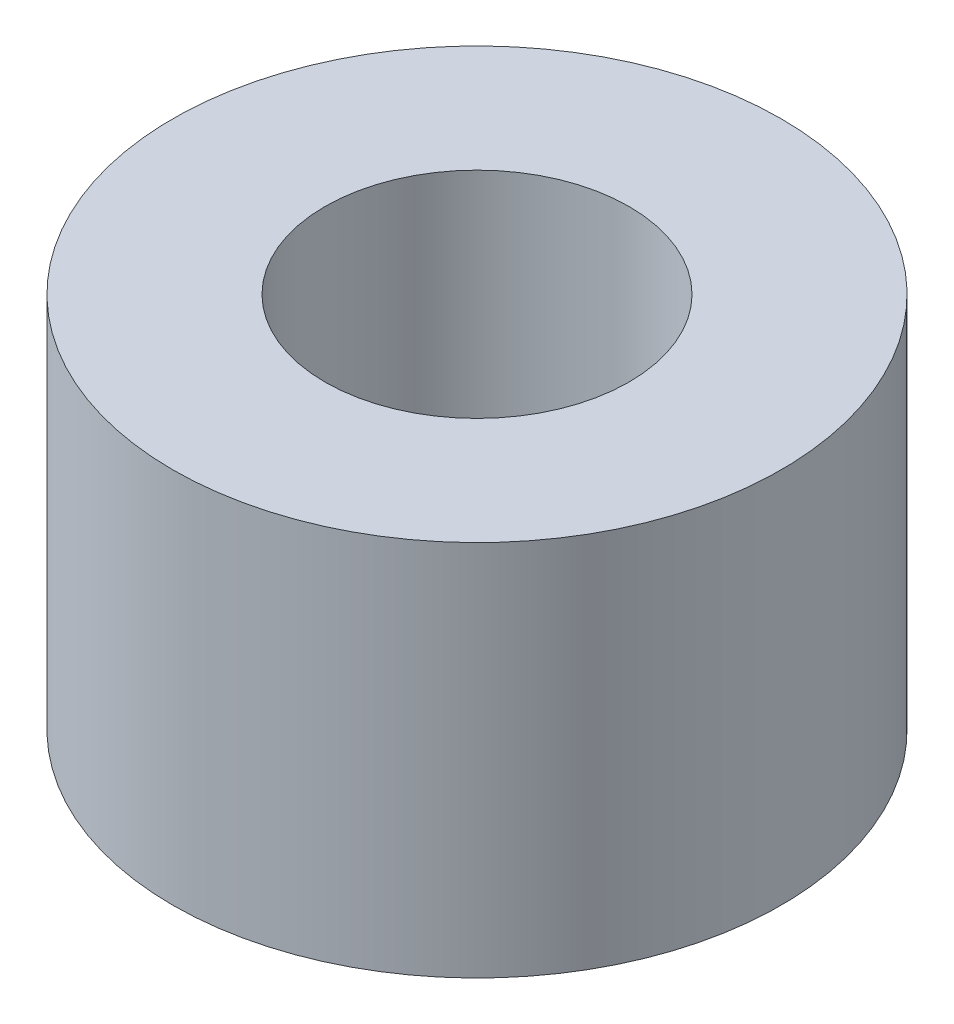
ISO-10303-21;
HEADER;
FILE_DESCRIPTION(('STEP AP214'),'2;1');
FILE_NAME('part.step','',(''),(''),'','','');
FILE_SCHEMA(('AUTOMOTIVE_DESIGN { 1 0 10303 214 1 1 1 1 }'));
ENDSEC;
DATA;
#1=APPLICATION_CONTEXT('core data for automotive mechanical design processes');
#2=APPLICATION_PROTOCOL_DEFINITION('international standard','automotive_design',2000,#1);
#3=PRODUCT_CONTEXT('',#1,'mechanical');
#4=PRODUCT('Part','Part','',(#3));
#5=PRODUCT_RELATED_PRODUCT_CATEGORY('part','',(#4));
#6=PRODUCT_DEFINITION_FORMATION('','',#4);
#7=PRODUCT_DEFINITION_CONTEXT('part definition',#1,'design');
#8=PRODUCT_DEFINITION('design','',#6,#7);
#9=PRODUCT_DEFINITION_SHAPE('','',#8);
#10=(LENGTH_UNIT() NAMED_UNIT(*) SI_UNIT(.MILLI.,.METRE.));
#11=(NAMED_UNIT(*) PLANE_ANGLE_UNIT() SI_UNIT($,.RADIAN.));
#12=(NAMED_UNIT(*) SI_UNIT($,.STERADIAN.) SOLID_ANGLE_UNIT());
#13=UNCERTAINTY_MEASURE_WITH_UNIT(LENGTH_MEASURE(1.E-05),#10,'distance_accuracy_value','');
#14=(GEOMETRIC_REPRESENTATION_CONTEXT(3) GLOBAL_UNCERTAINTY_ASSIGNED_CONTEXT((#13)) GLOBAL_UNIT_ASSIGNED_CONTEXT((#10,
#11,#12)) REPRESENTATION_CONTEXT('',''));
#15=CARTESIAN_POINT('',(0.,0.,0.));
#16=DIRECTION('',(0.,0.,1.));
#17=DIRECTION('',(1.,0.,0.));
#18=AXIS2_PLACEMENT_3D('',#15,#16,#17);
#19=CARTESIAN_POINT('',(0.,7.874,0.));
#20=DIRECTION('',(0.,1.,0.));
#21=DIRECTION('',(0.,0.,1.));
#22=AXIS2_PLACEMENT_3D('',#19,#20,#21);
#23=PLANE('',#22);
#24=CARTESIAN_POINT('',(0.,7.874,0.));
#25=DIRECTION('',(0.,1.,0.));
#26=DIRECTION('',(0.,0.,1.));
#27=AXIS2_PLACEMENT_3D('',#24,#25,#26);
#28=CIRCLE('',#27,6.35);
#29=CARTESIAN_POINT('',(0.,7.874,6.35));
#30=VERTEX_POINT('',#29);
#31=EDGE_CURVE('E10',#30,#30,#28,.T.);
#32=ORIENTED_EDGE('',*,*,#31,.T.);
#33=EDGE_LOOP('',(#32));
#34=FACE_BOUND('',#33,.T.);
#35=CARTESIAN_POINT('',(0.,7.874,0.));
#36=DIRECTION('',(0.,1.,0.));
#37=DIRECTION('',(0.,0.,1.));
#38=AXIS2_PLACEMENT_3D('',#35,#36,#37);
#39=CIRCLE('',#38,3.175);
#40=CARTESIAN_POINT('',(0.,7.874,3.175));
#41=VERTEX_POINT('',#40);
#42=EDGE_CURVE('E50',#41,#41,#39,.T.);
#43=ORIENTED_EDGE('',*,*,#42,.F.);
#44=EDGE_LOOP('',(#43));
#45=FACE_BOUND('',#44,.T.);
#46=ADVANCED_FACE('F39',(#34,#45),#23,.T.);
#47=CARTESIAN_POINT('',(0.,0.,0.));
#48=DIRECTION('',(0.,1.,0.));
#49=DIRECTION('',(0.,0.,1.));
#50=AXIS2_PLACEMENT_3D('',#47,#48,#49);
#51=PLANE('',#50);
#52=CARTESIAN_POINT('',(0.,0.,0.));
#53=DIRECTION('',(0.,1.,0.));
#54=DIRECTION('',(0.,0.,1.));
#55=AXIS2_PLACEMENT_3D('',#52,#53,#54);
#56=CIRCLE('',#55,6.35);
#57=CARTESIAN_POINT('',(0.,0.,6.35));
#58=VERTEX_POINT('',#57);
#59=EDGE_CURVE('E43',#58,#58,#56,.T.);
#60=ORIENTED_EDGE('',*,*,#59,.F.);
#61=EDGE_LOOP('',(#60));
#62=FACE_BOUND('',#61,.T.);
#63=CARTESIAN_POINT('',(0.,0.,0.));
#64=DIRECTION('',(0.,1.,0.));
#65=DIRECTION('',(0.,0.,1.));
#66=AXIS2_PLACEMENT_3D('',#63,#64,#65);
#67=CIRCLE('',#66,3.175);
#68=CARTESIAN_POINT('',(0.,0.,3.175));
#69=VERTEX_POINT('',#68);
#70=EDGE_CURVE('E52',#69,#69,#67,.T.);
#71=ORIENTED_EDGE('',*,*,#70,.T.);
#72=EDGE_LOOP('',(#71));
#73=FACE_BOUND('',#72,.T.);
#74=ADVANCED_FACE('F62',(#62,#73),#51,.F.);
#75=CARTESIAN_POINT('',(0.,7.874,0.));
#76=DIRECTION('',(0.,-1.,0.));
#77=DIRECTION('',(0.,0.,-1.));
#78=AXIS2_PLACEMENT_3D('',#75,#76,#77);
#79=CYLINDRICAL_SURFACE('',#78,6.35);
#80=ORIENTED_EDGE('',*,*,#31,.F.);
#81=EDGE_LOOP('',(#80));
#82=FACE_BOUND('',#81,.T.);
#83=ORIENTED_EDGE('',*,*,#59,.T.);
#84=EDGE_LOOP('',(#83));
#85=FACE_BOUND('',#84,.T.);
#86=ADVANCED_FACE('F41',(#82,#85),#79,.T.);
#87=CARTESIAN_POINT('',(0.,7.874,0.));
#88=DIRECTION('',(0.,-1.,0.));
#89=DIRECTION('',(0.,0.,-1.));
#90=AXIS2_PLACEMENT_3D('',#87,#88,#89);
#91=CYLINDRICAL_SURFACE('',#90,3.175);
#92=ORIENTED_EDGE('',*,*,#42,.T.);
#93=EDGE_LOOP('',(#92));
#94=FACE_BOUND('',#93,.T.);
#95=ORIENTED_EDGE('',*,*,#70,.F.);
#96=EDGE_LOOP('',(#95));
#97=FACE_BOUND('',#96,.T.);
#98=ADVANCED_FACE('F58',(#94,#97),#91,.F.);
#99=CLOSED_SHELL('',(#46,#74,#86,#98));
#100=MANIFOLD_SOLID_BREP('B2',#99);
#101=ADVANCED_BREP_SHAPE_REPRESENTATION('',(#18,#100),#14);
#102=SHAPE_DEFINITION_REPRESENTATION(#9,#101);
ENDSEC;
END-ISO-10303-21;
